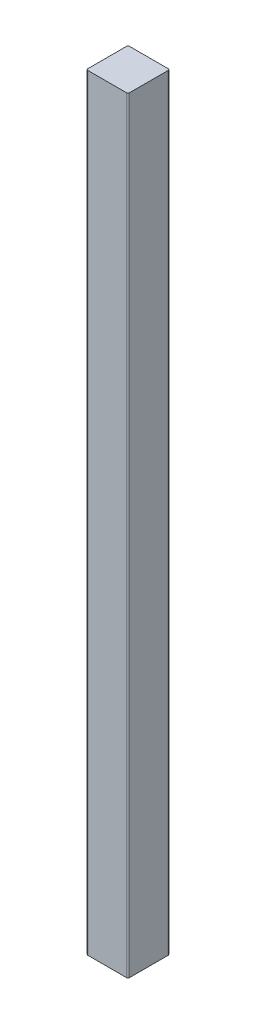
ISO-10303-21;
HEADER;
FILE_DESCRIPTION(('STEP AP214'),'2;1');
FILE_NAME('part.step','',(''),(''),'','','');
FILE_SCHEMA(('AUTOMOTIVE_DESIGN { 1 0 10303 214 1 1 1 1 }'));
ENDSEC;
DATA;
#1=APPLICATION_CONTEXT('core data for automotive mechanical design processes');
#2=APPLICATION_PROTOCOL_DEFINITION('international standard','automotive_design',2000,#1);
#3=PRODUCT_CONTEXT('',#1,'mechanical');
#4=PRODUCT('Part','Part','',(#3));
#5=PRODUCT_RELATED_PRODUCT_CATEGORY('part','',(#4));
#6=PRODUCT_DEFINITION_FORMATION('','',#4);
#7=PRODUCT_DEFINITION_CONTEXT('part definition',#1,'design');
#8=PRODUCT_DEFINITION('design','',#6,#7);
#9=PRODUCT_DEFINITION_SHAPE('','',#8);
#10=(LENGTH_UNIT() NAMED_UNIT(*) SI_UNIT(.MILLI.,.METRE.));
#11=(NAMED_UNIT(*) PLANE_ANGLE_UNIT() SI_UNIT($,.RADIAN.));
#12=(NAMED_UNIT(*) SI_UNIT($,.STERADIAN.) SOLID_ANGLE_UNIT());
#13=UNCERTAINTY_MEASURE_WITH_UNIT(LENGTH_MEASURE(1.E-05),#10,'distance_accuracy_value','');
#14=(GEOMETRIC_REPRESENTATION_CONTEXT(3) GLOBAL_UNCERTAINTY_ASSIGNED_CONTEXT((#13)) GLOBAL_UNIT_ASSIGNED_CONTEXT((#10,
#11,#12)) REPRESENTATION_CONTEXT('',''));
#15=CARTESIAN_POINT('',(0.,0.,0.));
#16=DIRECTION('',(0.,0.,1.));
#17=DIRECTION('',(1.,0.,0.));
#18=AXIS2_PLACEMENT_3D('',#15,#16,#17);
#19=CARTESIAN_POINT('',(44.45,1635.125,-44.45));
#20=DIRECTION('',(-1.,0.,0.));
#21=DIRECTION('',(0.,0.,1.));
#22=AXIS2_PLACEMENT_3D('',#19,#20,#21);
#23=PLANE('',#22);
#24=DIRECTION('',(0.,0.,-1.));
#25=VECTOR('',#24,1.);
#26=CARTESIAN_POINT('',(44.45,0.,-44.45));
#27=LINE('',#26,#25);
#28=CARTESIAN_POINT('',(44.45,0.,41.275));
#29=VERTEX_POINT('',#28);
#30=CARTESIAN_POINT('',(44.45,0.,-41.275));
#31=VERTEX_POINT('',#30);
#32=EDGE_CURVE('E157',#29,#31,#27,.T.);
#33=ORIENTED_EDGE('',*,*,#32,.T.);
#34=DIRECTION('',(0.,-1.,0.));
#35=VECTOR('',#34,1.);
#36=CARTESIAN_POINT('',(44.45,1635.125,-41.275));
#37=LINE('',#36,#35);
#38=CARTESIAN_POINT('',(44.45,1635.125,-41.275));
#39=VERTEX_POINT('',#38);
#40=EDGE_CURVE('E11',#31,#39,#37,.F.);
#41=ORIENTED_EDGE('',*,*,#40,.T.);
#42=DIRECTION('',(0.,0.,-1.));
#43=VECTOR('',#42,1.);
#44=CARTESIAN_POINT('',(44.45,1635.125,-44.45));
#45=LINE('',#44,#43);
#46=CARTESIAN_POINT('',(44.45,1635.125,41.275));
#47=VERTEX_POINT('',#46);
#48=EDGE_CURVE('E125',#47,#39,#45,.T.);
#49=ORIENTED_EDGE('',*,*,#48,.F.);
#50=DIRECTION('',(0.,-1.,0.));
#51=VECTOR('',#50,1.);
#52=CARTESIAN_POINT('',(44.45,1635.125,41.275));
#53=LINE('',#52,#51);
#54=EDGE_CURVE('E41',#47,#29,#53,.T.);
#55=ORIENTED_EDGE('',*,*,#54,.T.);
#56=EDGE_LOOP('',(#33,#41,#49,#55));
#57=FACE_BOUND('',#56,.T.);
#58=ADVANCED_FACE('F33',(#57),#23,.F.);
#59=CARTESIAN_POINT('',(-44.45,1635.125,-44.45));
#60=DIRECTION('',(0.,0.,1.));
#61=DIRECTION('',(1.,0.,0.));
#62=AXIS2_PLACEMENT_3D('',#59,#60,#61);
#63=PLANE('',#62);
#64=DIRECTION('',(-1.,0.,0.));
#65=VECTOR('',#64,1.);
#66=CARTESIAN_POINT('',(-44.45,0.,-44.45));
#67=LINE('',#66,#65);
#68=CARTESIAN_POINT('',(41.275,0.,-44.45));
#69=VERTEX_POINT('',#68);
#70=CARTESIAN_POINT('',(-41.275,0.,-44.45));
#71=VERTEX_POINT('',#70);
#72=EDGE_CURVE('E130',#69,#71,#67,.T.);
#73=ORIENTED_EDGE('',*,*,#72,.T.);
#74=DIRECTION('',(0.,-1.,0.));
#75=VECTOR('',#74,1.);
#76=CARTESIAN_POINT('',(-41.275,1635.125,-44.45));
#77=LINE('',#76,#75);
#78=CARTESIAN_POINT('',(-41.275,1635.125,-44.45));
#79=VERTEX_POINT('',#78);
#80=EDGE_CURVE('E48',#71,#79,#77,.F.);
#81=ORIENTED_EDGE('',*,*,#80,.T.);
#82=DIRECTION('',(-1.,0.,0.));
#83=VECTOR('',#82,1.);
#84=CARTESIAN_POINT('',(-44.45,1635.125,-44.45));
#85=LINE('',#84,#83);
#86=CARTESIAN_POINT('',(41.275,1635.125,-44.45));
#87=VERTEX_POINT('',#86);
#88=EDGE_CURVE('E128',#87,#79,#85,.T.);
#89=ORIENTED_EDGE('',*,*,#88,.F.);
#90=DIRECTION('',(0.,-1.,0.));
#91=VECTOR('',#90,1.);
#92=CARTESIAN_POINT('',(41.275,1635.125,-44.45));
#93=LINE('',#92,#91);
#94=EDGE_CURVE('E149',#87,#69,#93,.T.);
#95=ORIENTED_EDGE('',*,*,#94,.T.);
#96=EDGE_LOOP('',(#73,#81,#89,#95));
#97=FACE_BOUND('',#96,.T.);
#98=ADVANCED_FACE('F177',(#97),#63,.F.);
#99=CARTESIAN_POINT('',(-44.45,1635.125,-44.45));
#100=DIRECTION('',(1.,0.,0.));
#101=DIRECTION('',(0.,0.,-1.));
#102=AXIS2_PLACEMENT_3D('',#99,#100,#101);
#103=PLANE('',#102);
#104=DIRECTION('',(0.,0.,1.));
#105=VECTOR('',#104,1.);
#106=CARTESIAN_POINT('',(-44.45,0.,-44.45));
#107=LINE('',#106,#105);
#108=CARTESIAN_POINT('',(-44.45,0.,-41.275));
#109=VERTEX_POINT('',#108);
#110=CARTESIAN_POINT('',(-44.45,0.,41.275));
#111=VERTEX_POINT('',#110);
#112=EDGE_CURVE('E126',#109,#111,#107,.T.);
#113=ORIENTED_EDGE('',*,*,#112,.T.);
#114=DIRECTION('',(0.,-1.,0.));
#115=VECTOR('',#114,1.);
#116=CARTESIAN_POINT('',(-44.45,1635.125,41.275));
#117=LINE('',#116,#115);
#118=CARTESIAN_POINT('',(-44.45,1635.125,41.275));
#119=VERTEX_POINT('',#118);
#120=EDGE_CURVE('E104',#111,#119,#117,.F.);
#121=ORIENTED_EDGE('',*,*,#120,.T.);
#122=DIRECTION('',(0.,0.,1.));
#123=VECTOR('',#122,1.);
#124=CARTESIAN_POINT('',(-44.45,1635.125,-44.45));
#125=LINE('',#124,#123);
#126=CARTESIAN_POINT('',(-44.45,1635.125,-41.275));
#127=VERTEX_POINT('',#126);
#128=EDGE_CURVE('E165',#127,#119,#125,.T.);
#129=ORIENTED_EDGE('',*,*,#128,.F.);
#130=DIRECTION('',(0.,-1.,0.));
#131=VECTOR('',#130,1.);
#132=CARTESIAN_POINT('',(-44.45,1635.125,-41.275));
#133=LINE('',#132,#131);
#134=EDGE_CURVE('E109',#127,#109,#133,.T.);
#135=ORIENTED_EDGE('',*,*,#134,.T.);
#136=EDGE_LOOP('',(#113,#121,#129,#135));
#137=FACE_BOUND('',#136,.T.);
#138=ADVANCED_FACE('F176',(#137),#103,.F.);
#139=CARTESIAN_POINT('',(-44.45,1635.125,44.45));
#140=DIRECTION('',(0.,0.,-1.));
#141=DIRECTION('',(-1.,0.,0.));
#142=AXIS2_PLACEMENT_3D('',#139,#140,#141);
#143=PLANE('',#142);
#144=DIRECTION('',(1.,0.,0.));
#145=VECTOR('',#144,1.);
#146=CARTESIAN_POINT('',(-44.45,1635.125,44.45));
#147=LINE('',#146,#145);
#148=CARTESIAN_POINT('',(-41.275,1635.125,44.45));
#149=VERTEX_POINT('',#148);
#150=CARTESIAN_POINT('',(41.275,1635.125,44.45));
#151=VERTEX_POINT('',#150);
#152=EDGE_CURVE('E119',#149,#151,#147,.T.);
#153=ORIENTED_EDGE('',*,*,#152,.F.);
#154=DIRECTION('',(0.,-1.,0.));
#155=VECTOR('',#154,1.);
#156=CARTESIAN_POINT('',(-41.275,1635.125,44.45));
#157=LINE('',#156,#155);
#158=CARTESIAN_POINT('',(-41.275,0.,44.45));
#159=VERTEX_POINT('',#158);
#160=EDGE_CURVE('E103',#149,#159,#157,.T.);
#161=ORIENTED_EDGE('',*,*,#160,.T.);
#162=DIRECTION('',(1.,0.,0.));
#163=VECTOR('',#162,1.);
#164=CARTESIAN_POINT('',(-44.45,0.,44.45));
#165=LINE('',#164,#163);
#166=CARTESIAN_POINT('',(41.275,0.,44.45));
#167=VERTEX_POINT('',#166);
#168=EDGE_CURVE('E116',#159,#167,#165,.T.);
#169=ORIENTED_EDGE('',*,*,#168,.T.);
#170=DIRECTION('',(0.,-1.,0.));
#171=VECTOR('',#170,1.);
#172=CARTESIAN_POINT('',(41.275,1635.125,44.45));
#173=LINE('',#172,#171);
#174=EDGE_CURVE('E121',#167,#151,#173,.F.);
#175=ORIENTED_EDGE('',*,*,#174,.T.);
#176=EDGE_LOOP('',(#153,#161,#169,#175));
#177=FACE_BOUND('',#176,.T.);
#178=ADVANCED_FACE('F115',(#177),#143,.F.);
#179=CARTESIAN_POINT('',(0.,1635.125,0.));
#180=DIRECTION('',(0.,1.,0.));
#181=DIRECTION('',(0.,0.,1.));
#182=AXIS2_PLACEMENT_3D('',#179,#180,#181);
#183=PLANE('',#182);
#184=ORIENTED_EDGE('',*,*,#128,.T.);
#185=CARTESIAN_POINT('',(-41.275,1635.125,41.275));
#186=DIRECTION('',(0.,1.,0.));
#187=DIRECTION('',(0.,0.,1.));
#188=AXIS2_PLACEMENT_3D('',#185,#186,#187);
#189=CIRCLE('',#188,3.175);
#190=EDGE_CURVE('E147',#119,#149,#189,.T.);
#191=ORIENTED_EDGE('',*,*,#190,.T.);
#192=ORIENTED_EDGE('',*,*,#152,.T.);
#193=CARTESIAN_POINT('',(41.275,1635.125,41.275));
#194=DIRECTION('',(0.,1.,0.));
#195=DIRECTION('',(0.,0.,1.));
#196=AXIS2_PLACEMENT_3D('',#193,#194,#195);
#197=CIRCLE('',#196,3.175);
#198=EDGE_CURVE('E142',#151,#47,#197,.T.);
#199=ORIENTED_EDGE('',*,*,#198,.T.);
#200=ORIENTED_EDGE('',*,*,#48,.T.);
#201=CARTESIAN_POINT('',(41.275,1635.125,-41.275));
#202=DIRECTION('',(0.,1.,0.));
#203=DIRECTION('',(0.,0.,1.));
#204=AXIS2_PLACEMENT_3D('',#201,#202,#203);
#205=CIRCLE('',#204,3.175);
#206=EDGE_CURVE('E55',#39,#87,#205,.T.);
#207=ORIENTED_EDGE('',*,*,#206,.T.);
#208=ORIENTED_EDGE('',*,*,#88,.T.);
#209=CARTESIAN_POINT('',(-41.275,1635.125,-41.275));
#210=DIRECTION('',(0.,1.,0.));
#211=DIRECTION('',(0.,0.,1.));
#212=AXIS2_PLACEMENT_3D('',#209,#210,#211);
#213=CIRCLE('',#212,3.175);
#214=EDGE_CURVE('E145',#79,#127,#213,.T.);
#215=ORIENTED_EDGE('',*,*,#214,.T.);
#216=EDGE_LOOP('',(#184,#191,#192,#199,#200,#207,#208,#215));
#217=FACE_BOUND('',#216,.T.);
#218=ADVANCED_FACE('F169',(#217),#183,.T.);
#219=CARTESIAN_POINT('',(0.,0.,0.));
#220=DIRECTION('',(0.,1.,0.));
#221=DIRECTION('',(0.,0.,1.));
#222=AXIS2_PLACEMENT_3D('',#219,#220,#221);
#223=PLANE('',#222);
#224=ORIENTED_EDGE('',*,*,#168,.F.);
#225=CARTESIAN_POINT('',(-41.275,0.,41.275));
#226=DIRECTION('',(0.,1.,0.));
#227=DIRECTION('',(0.,0.,1.));
#228=AXIS2_PLACEMENT_3D('',#225,#226,#227);
#229=CIRCLE('',#228,3.175);
#230=EDGE_CURVE('E99',#159,#111,#229,.F.);
#231=ORIENTED_EDGE('',*,*,#230,.T.);
#232=ORIENTED_EDGE('',*,*,#112,.F.);
#233=CARTESIAN_POINT('',(-41.275,0.,-41.275));
#234=DIRECTION('',(0.,1.,0.));
#235=DIRECTION('',(0.,0.,1.));
#236=AXIS2_PLACEMENT_3D('',#233,#234,#235);
#237=CIRCLE('',#236,3.175);
#238=EDGE_CURVE('E110',#109,#71,#237,.F.);
#239=ORIENTED_EDGE('',*,*,#238,.T.);
#240=ORIENTED_EDGE('',*,*,#72,.F.);
#241=CARTESIAN_POINT('',(41.275,0.,-41.275));
#242=DIRECTION('',(0.,1.,0.));
#243=DIRECTION('',(0.,0.,1.));
#244=AXIS2_PLACEMENT_3D('',#241,#242,#243);
#245=CIRCLE('',#244,3.175);
#246=EDGE_CURVE('E136',#69,#31,#245,.F.);
#247=ORIENTED_EDGE('',*,*,#246,.T.);
#248=ORIENTED_EDGE('',*,*,#32,.F.);
#249=CARTESIAN_POINT('',(41.275,0.,41.275));
#250=DIRECTION('',(0.,1.,0.));
#251=DIRECTION('',(0.,0.,1.));
#252=AXIS2_PLACEMENT_3D('',#249,#250,#251);
#253=CIRCLE('',#252,3.175);
#254=EDGE_CURVE('E120',#29,#167,#253,.F.);
#255=ORIENTED_EDGE('',*,*,#254,.T.);
#256=EDGE_LOOP('',(#224,#231,#232,#239,#240,#247,#248,#255));
#257=FACE_BOUND('',#256,.T.);
#258=ADVANCED_FACE('F123',(#257),#223,.F.);
#259=CARTESIAN_POINT('',(-41.275,1635.125,41.275));
#260=DIRECTION('',(0.,-1.,0.));
#261=DIRECTION('',(0.,0.,-1.));
#262=AXIS2_PLACEMENT_3D('',#259,#260,#261);
#263=CYLINDRICAL_SURFACE('',#262,3.175);
#264=ORIENTED_EDGE('',*,*,#190,.F.);
#265=ORIENTED_EDGE('',*,*,#120,.F.);
#266=ORIENTED_EDGE('',*,*,#230,.F.);
#267=ORIENTED_EDGE('',*,*,#160,.F.);
#268=EDGE_LOOP('',(#264,#265,#266,#267));
#269=FACE_BOUND('',#268,.T.);
#270=ADVANCED_FACE('F102',(#269),#263,.T.);
#271=CARTESIAN_POINT('',(-41.275,1635.125,-41.275));
#272=DIRECTION('',(0.,-1.,0.));
#273=DIRECTION('',(0.,0.,-1.));
#274=AXIS2_PLACEMENT_3D('',#271,#272,#273);
#275=CYLINDRICAL_SURFACE('',#274,3.175);
#276=ORIENTED_EDGE('',*,*,#214,.F.);
#277=ORIENTED_EDGE('',*,*,#80,.F.);
#278=ORIENTED_EDGE('',*,*,#238,.F.);
#279=ORIENTED_EDGE('',*,*,#134,.F.);
#280=EDGE_LOOP('',(#276,#277,#278,#279));
#281=FACE_BOUND('',#280,.T.);
#282=ADVANCED_FACE('F174',(#281),#275,.T.);
#283=CARTESIAN_POINT('',(41.275,1635.125,-41.275));
#284=DIRECTION('',(0.,-1.,0.));
#285=DIRECTION('',(0.,0.,-1.));
#286=AXIS2_PLACEMENT_3D('',#283,#284,#285);
#287=CYLINDRICAL_SURFACE('',#286,3.175);
#288=ORIENTED_EDGE('',*,*,#206,.F.);
#289=ORIENTED_EDGE('',*,*,#40,.F.);
#290=ORIENTED_EDGE('',*,*,#246,.F.);
#291=ORIENTED_EDGE('',*,*,#94,.F.);
#292=EDGE_LOOP('',(#288,#289,#290,#291));
#293=FACE_BOUND('',#292,.T.);
#294=ADVANCED_FACE('F179',(#293),#287,.T.);
#295=CARTESIAN_POINT('',(41.275,1635.125,41.275));
#296=DIRECTION('',(0.,-1.,0.));
#297=DIRECTION('',(0.,0.,-1.));
#298=AXIS2_PLACEMENT_3D('',#295,#296,#297);
#299=CYLINDRICAL_SURFACE('',#298,3.175);
#300=ORIENTED_EDGE('',*,*,#198,.F.);
#301=ORIENTED_EDGE('',*,*,#174,.F.);
#302=ORIENTED_EDGE('',*,*,#254,.F.);
#303=ORIENTED_EDGE('',*,*,#54,.F.);
#304=EDGE_LOOP('',(#300,#301,#302,#303));
#305=FACE_BOUND('',#304,.T.);
#306=ADVANCED_FACE('F35',(#305),#299,.T.);
#307=CLOSED_SHELL('',(#58,#98,#138,#178,#218,#258,#270,#282,#294,#306));
#308=MANIFOLD_SOLID_BREP('B2',#307);
#309=ADVANCED_BREP_SHAPE_REPRESENTATION('',(#18,#308),#14);
#310=SHAPE_DEFINITION_REPRESENTATION(#9,#309);
ENDSEC;
END-ISO-10303-21;
